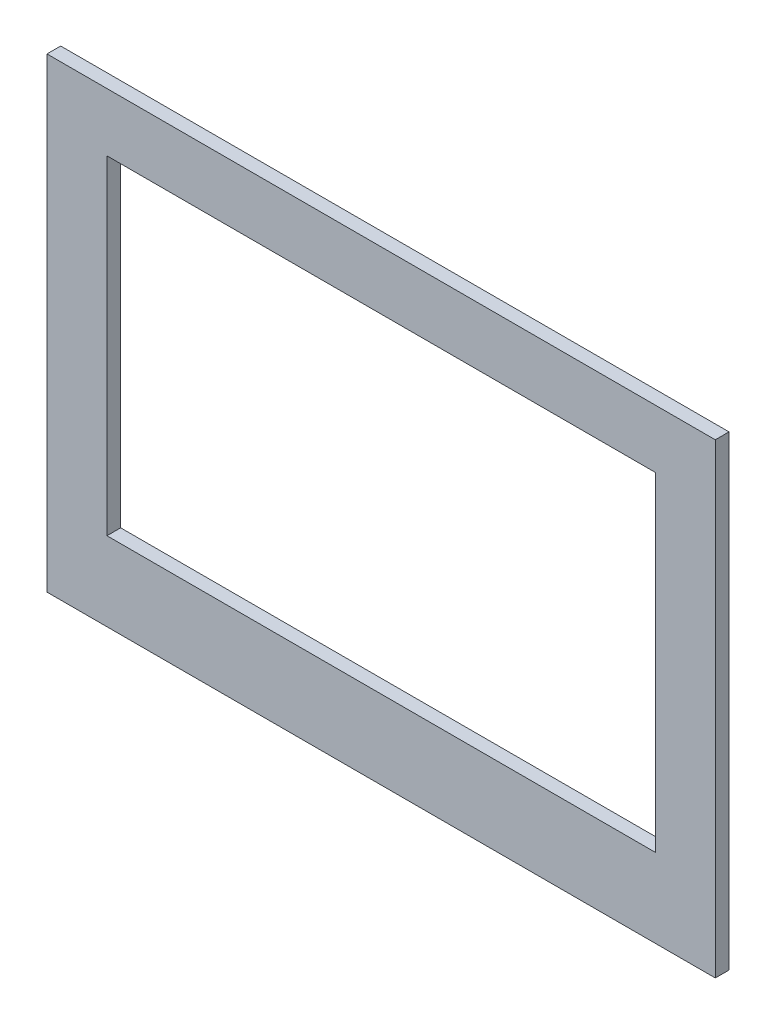
ISO-10303-21;
HEADER;
FILE_DESCRIPTION(('STEP AP214'),'2;1');
FILE_NAME('part.step','',(''),(''),'','','');
FILE_SCHEMA(('AUTOMOTIVE_DESIGN { 1 0 10303 214 1 1 1 1 }'));
ENDSEC;
DATA;
#1=APPLICATION_CONTEXT('core data for automotive mechanical design processes');
#2=APPLICATION_PROTOCOL_DEFINITION('international standard','automotive_design',2000,#1);
#3=PRODUCT_CONTEXT('',#1,'mechanical');
#4=PRODUCT('Part','Part','',(#3));
#5=PRODUCT_RELATED_PRODUCT_CATEGORY('part','',(#4));
#6=PRODUCT_DEFINITION_FORMATION('','',#4);
#7=PRODUCT_DEFINITION_CONTEXT('part definition',#1,'design');
#8=PRODUCT_DEFINITION('design','',#6,#7);
#9=PRODUCT_DEFINITION_SHAPE('','',#8);
#10=(LENGTH_UNIT() NAMED_UNIT(*) SI_UNIT(.MILLI.,.METRE.));
#11=(NAMED_UNIT(*) PLANE_ANGLE_UNIT() SI_UNIT($,.RADIAN.));
#12=(NAMED_UNIT(*) SI_UNIT($,.STERADIAN.) SOLID_ANGLE_UNIT());
#13=UNCERTAINTY_MEASURE_WITH_UNIT(LENGTH_MEASURE(1.E-05),#10,'distance_accuracy_value','');
#14=(GEOMETRIC_REPRESENTATION_CONTEXT(3) GLOBAL_UNCERTAINTY_ASSIGNED_CONTEXT((#13)) GLOBAL_UNIT_ASSIGNED_CONTEXT((#10,
#11,#12)) REPRESENTATION_CONTEXT('',''));
#15=CARTESIAN_POINT('',(0.,0.,0.));
#16=DIRECTION('',(0.,0.,1.));
#17=DIRECTION('',(1.,0.,0.));
#18=AXIS2_PLACEMENT_3D('',#15,#16,#17);
#19=CARTESIAN_POINT('',(0.,68.,-2.));
#20=DIRECTION('',(0.,1.,0.));
#21=DIRECTION('',(0.,0.,1.));
#22=AXIS2_PLACEMENT_3D('',#19,#20,#21);
#23=PLANE('',#22);
#24=DIRECTION('',(0.,0.,1.));
#25=VECTOR('',#24,1.);
#26=CARTESIAN_POINT('',(-97.5,68.,-2.));
#27=LINE('',#26,#25);
#28=CARTESIAN_POINT('',(-97.5,68.,-2.));
#29=VERTEX_POINT('',#28);
#30=CARTESIAN_POINT('',(-97.5,68.,2.));
#31=VERTEX_POINT('',#30);
#32=EDGE_CURVE('E110',#29,#31,#27,.T.);
#33=ORIENTED_EDGE('',*,*,#32,.T.);
#34=DIRECTION('',(-1.,0.,0.));
#35=VECTOR('',#34,1.);
#36=CARTESIAN_POINT('',(0.,68.,2.));
#37=LINE('',#36,#35);
#38=CARTESIAN_POINT('',(97.4999999999999,68.,2.));
#39=VERTEX_POINT('',#38);
#40=EDGE_CURVE('E113',#39,#31,#37,.T.);
#41=ORIENTED_EDGE('',*,*,#40,.F.);
#42=DIRECTION('',(0.,0.,1.));
#43=VECTOR('',#42,1.);
#44=CARTESIAN_POINT('',(97.4999999999999,68.,-2.));
#45=LINE('',#44,#43);
#46=CARTESIAN_POINT('',(97.4999999999999,68.,-2.));
#47=VERTEX_POINT('',#46);
#48=EDGE_CURVE('E11',#47,#39,#45,.T.);
#49=ORIENTED_EDGE('',*,*,#48,.F.);
#50=DIRECTION('',(-1.,0.,0.));
#51=VECTOR('',#50,1.);
#52=CARTESIAN_POINT('',(0.,68.,-2.));
#53=LINE('',#52,#51);
#54=EDGE_CURVE('E116',#47,#29,#53,.T.);
#55=ORIENTED_EDGE('',*,*,#54,.T.);
#56=EDGE_LOOP('',(#33,#41,#49,#55));
#57=FACE_BOUND('',#56,.T.);
#58=ADVANCED_FACE('F46',(#57),#23,.T.);
#59=CARTESIAN_POINT('',(97.4999999999999,0.,-2.));
#60=DIRECTION('',(-1.,0.,0.));
#61=DIRECTION('',(0.,0.,1.));
#62=AXIS2_PLACEMENT_3D('',#59,#60,#61);
#63=PLANE('',#62);
#64=ORIENTED_EDGE('',*,*,#48,.T.);
#65=DIRECTION('',(0.,-1.,0.));
#66=VECTOR('',#65,1.);
#67=CARTESIAN_POINT('',(97.4999999999999,0.,2.));
#68=LINE('',#67,#66);
#69=CARTESIAN_POINT('',(97.4999999999999,-68.,2.));
#70=VERTEX_POINT('',#69);
#71=EDGE_CURVE('E136',#39,#70,#68,.T.);
#72=ORIENTED_EDGE('',*,*,#71,.T.);
#73=DIRECTION('',(0.,0.,1.));
#74=VECTOR('',#73,1.);
#75=CARTESIAN_POINT('',(97.4999999999999,-68.,-2.));
#76=LINE('',#75,#74);
#77=CARTESIAN_POINT('',(97.4999999999999,-68.,-2.));
#78=VERTEX_POINT('',#77);
#79=EDGE_CURVE('E56',#78,#70,#76,.T.);
#80=ORIENTED_EDGE('',*,*,#79,.F.);
#81=DIRECTION('',(0.,-1.,0.));
#82=VECTOR('',#81,1.);
#83=CARTESIAN_POINT('',(97.4999999999999,0.,-2.));
#84=LINE('',#83,#82);
#85=EDGE_CURVE('E187',#47,#78,#84,.T.);
#86=ORIENTED_EDGE('',*,*,#85,.F.);
#87=EDGE_LOOP('',(#64,#72,#80,#86));
#88=FACE_BOUND('',#87,.T.);
#89=ADVANCED_FACE('F229',(#88),#63,.F.);
#90=CARTESIAN_POINT('',(0.,-68.,-2.));
#91=DIRECTION('',(0.,1.,0.));
#92=DIRECTION('',(0.,0.,1.));
#93=AXIS2_PLACEMENT_3D('',#90,#91,#92);
#94=PLANE('',#93);
#95=ORIENTED_EDGE('',*,*,#79,.T.);
#96=DIRECTION('',(-1.,0.,0.));
#97=VECTOR('',#96,1.);
#98=CARTESIAN_POINT('',(0.,-68.,2.));
#99=LINE('',#98,#97);
#100=CARTESIAN_POINT('',(-97.5,-68.,2.));
#101=VERTEX_POINT('',#100);
#102=EDGE_CURVE('E131',#70,#101,#99,.T.);
#103=ORIENTED_EDGE('',*,*,#102,.T.);
#104=DIRECTION('',(0.,0.,1.));
#105=VECTOR('',#104,1.);
#106=CARTESIAN_POINT('',(-97.5,-68.,-2.));
#107=LINE('',#106,#105);
#108=CARTESIAN_POINT('',(-97.5,-68.,-2.));
#109=VERTEX_POINT('',#108);
#110=EDGE_CURVE('E121',#109,#101,#107,.T.);
#111=ORIENTED_EDGE('',*,*,#110,.F.);
#112=DIRECTION('',(-1.,0.,0.));
#113=VECTOR('',#112,1.);
#114=CARTESIAN_POINT('',(0.,-68.,-2.));
#115=LINE('',#114,#113);
#116=EDGE_CURVE('E70',#78,#109,#115,.T.);
#117=ORIENTED_EDGE('',*,*,#116,.F.);
#118=EDGE_LOOP('',(#95,#103,#111,#117));
#119=FACE_BOUND('',#118,.T.);
#120=ADVANCED_FACE('F234',(#119),#94,.F.);
#121=CARTESIAN_POINT('',(0.,-45.,-2.));
#122=DIRECTION('',(0.,1.,0.));
#123=DIRECTION('',(-1.,0.,0.));
#124=AXIS2_PLACEMENT_3D('',#121,#122,#123);
#125=PLANE('',#124);
#126=DIRECTION('',(0.,0.,1.));
#127=VECTOR('',#126,1.);
#128=CARTESIAN_POINT('',(-80.,-45.,-2.));
#129=LINE('',#128,#127);
#130=CARTESIAN_POINT('',(-80.,-45.,-2.));
#131=VERTEX_POINT('',#130);
#132=CARTESIAN_POINT('',(-80.,-45.,2.));
#133=VERTEX_POINT('',#132);
#134=EDGE_CURVE('E50',#131,#133,#129,.T.);
#135=ORIENTED_EDGE('',*,*,#134,.T.);
#136=DIRECTION('',(-1.,0.,0.));
#137=VECTOR('',#136,1.);
#138=CARTESIAN_POINT('',(0.,-45.,2.));
#139=LINE('',#138,#137);
#140=CARTESIAN_POINT('',(80.,-45.,2.));
#141=VERTEX_POINT('',#140);
#142=EDGE_CURVE('E150',#141,#133,#139,.T.);
#143=ORIENTED_EDGE('',*,*,#142,.F.);
#144=DIRECTION('',(0.,0.,1.));
#145=VECTOR('',#144,1.);
#146=CARTESIAN_POINT('',(80.,-45.,-2.));
#147=LINE('',#146,#145);
#148=CARTESIAN_POINT('',(80.,-45.,-2.));
#149=VERTEX_POINT('',#148);
#150=EDGE_CURVE('E122',#149,#141,#147,.T.);
#151=ORIENTED_EDGE('',*,*,#150,.F.);
#152=DIRECTION('',(-1.,0.,0.));
#153=VECTOR('',#152,1.);
#154=CARTESIAN_POINT('',(0.,-45.,-2.));
#155=LINE('',#154,#153);
#156=EDGE_CURVE('E166',#149,#131,#155,.T.);
#157=ORIENTED_EDGE('',*,*,#156,.T.);
#158=EDGE_LOOP('',(#135,#143,#151,#157));
#159=FACE_BOUND('',#158,.T.);
#160=ADVANCED_FACE('F48',(#159),#125,.T.);
#161=CARTESIAN_POINT('',(80.,0.,-2.));
#162=DIRECTION('',(1.,0.,0.));
#163=DIRECTION('',(0.,0.,-1.));
#164=AXIS2_PLACEMENT_3D('',#161,#162,#163);
#165=PLANE('',#164);
#166=ORIENTED_EDGE('',*,*,#150,.T.);
#167=DIRECTION('',(0.,1.,0.));
#168=VECTOR('',#167,1.);
#169=CARTESIAN_POINT('',(80.,0.,2.));
#170=LINE('',#169,#168);
#171=CARTESIAN_POINT('',(80.,51.,2.));
#172=VERTEX_POINT('',#171);
#173=EDGE_CURVE('E162',#141,#172,#170,.T.);
#174=ORIENTED_EDGE('',*,*,#173,.T.);
#175=DIRECTION('',(0.,0.,1.));
#176=VECTOR('',#175,1.);
#177=CARTESIAN_POINT('',(80.,51.,-2.));
#178=LINE('',#177,#176);
#179=CARTESIAN_POINT('',(80.,51.,-2.));
#180=VERTEX_POINT('',#179);
#181=EDGE_CURVE('E196',#180,#172,#178,.T.);
#182=ORIENTED_EDGE('',*,*,#181,.F.);
#183=DIRECTION('',(0.,1.,0.));
#184=VECTOR('',#183,1.);
#185=CARTESIAN_POINT('',(80.,0.,-2.));
#186=LINE('',#185,#184);
#187=EDGE_CURVE('E177',#149,#180,#186,.T.);
#188=ORIENTED_EDGE('',*,*,#187,.F.);
#189=EDGE_LOOP('',(#166,#174,#182,#188));
#190=FACE_BOUND('',#189,.T.);
#191=ADVANCED_FACE('F213',(#190),#165,.F.);
#192=CARTESIAN_POINT('',(0.,51.,-2.));
#193=DIRECTION('',(0.,1.,0.));
#194=DIRECTION('',(-1.,0.,0.));
#195=AXIS2_PLACEMENT_3D('',#192,#193,#194);
#196=PLANE('',#195);
#197=ORIENTED_EDGE('',*,*,#181,.T.);
#198=DIRECTION('',(-1.,0.,0.));
#199=VECTOR('',#198,1.);
#200=CARTESIAN_POINT('',(0.,51.,2.));
#201=LINE('',#200,#199);
#202=CARTESIAN_POINT('',(-80.,51.,2.));
#203=VERTEX_POINT('',#202);
#204=EDGE_CURVE('E158',#172,#203,#201,.T.);
#205=ORIENTED_EDGE('',*,*,#204,.T.);
#206=DIRECTION('',(0.,0.,1.));
#207=VECTOR('',#206,1.);
#208=CARTESIAN_POINT('',(-80.,51.,-2.));
#209=LINE('',#208,#207);
#210=CARTESIAN_POINT('',(-80.,51.,-2.));
#211=VERTEX_POINT('',#210);
#212=EDGE_CURVE('E198',#211,#203,#209,.T.);
#213=ORIENTED_EDGE('',*,*,#212,.F.);
#214=DIRECTION('',(-1.,0.,0.));
#215=VECTOR('',#214,1.);
#216=CARTESIAN_POINT('',(0.,51.,-2.));
#217=LINE('',#216,#215);
#218=EDGE_CURVE('E174',#180,#211,#217,.T.);
#219=ORIENTED_EDGE('',*,*,#218,.F.);
#220=EDGE_LOOP('',(#197,#205,#213,#219));
#221=FACE_BOUND('',#220,.T.);
#222=ADVANCED_FACE('F220',(#221),#196,.F.);
#223=CARTESIAN_POINT('',(-80.,0.,-2.));
#224=DIRECTION('',(1.,0.,0.));
#225=DIRECTION('',(0.,0.,-1.));
#226=AXIS2_PLACEMENT_3D('',#223,#224,#225);
#227=PLANE('',#226);
#228=ORIENTED_EDGE('',*,*,#212,.T.);
#229=DIRECTION('',(0.,1.,0.));
#230=VECTOR('',#229,1.);
#231=CARTESIAN_POINT('',(-80.,0.,2.));
#232=LINE('',#231,#230);
#233=EDGE_CURVE('E154',#133,#203,#232,.T.);
#234=ORIENTED_EDGE('',*,*,#233,.F.);
#235=ORIENTED_EDGE('',*,*,#134,.F.);
#236=DIRECTION('',(0.,1.,0.));
#237=VECTOR('',#236,1.);
#238=CARTESIAN_POINT('',(-80.,0.,-2.));
#239=LINE('',#238,#237);
#240=EDGE_CURVE('E170',#131,#211,#239,.T.);
#241=ORIENTED_EDGE('',*,*,#240,.T.);
#242=EDGE_LOOP('',(#228,#234,#235,#241));
#243=FACE_BOUND('',#242,.T.);
#244=ADVANCED_FACE('F209',(#243),#227,.T.);
#245=CARTESIAN_POINT('',(-97.5,0.,-2.));
#246=DIRECTION('',(-1.,0.,0.));
#247=DIRECTION('',(0.,0.,1.));
#248=AXIS2_PLACEMENT_3D('',#245,#246,#247);
#249=PLANE('',#248);
#250=ORIENTED_EDGE('',*,*,#110,.T.);
#251=DIRECTION('',(0.,-1.,0.));
#252=VECTOR('',#251,1.);
#253=CARTESIAN_POINT('',(-97.5,0.,2.));
#254=LINE('',#253,#252);
#255=EDGE_CURVE('E125',#31,#101,#254,.T.);
#256=ORIENTED_EDGE('',*,*,#255,.F.);
#257=ORIENTED_EDGE('',*,*,#32,.F.);
#258=DIRECTION('',(0.,-1.,0.));
#259=VECTOR('',#258,1.);
#260=CARTESIAN_POINT('',(-97.5,0.,-2.));
#261=LINE('',#260,#259);
#262=EDGE_CURVE('E182',#29,#109,#261,.T.);
#263=ORIENTED_EDGE('',*,*,#262,.T.);
#264=EDGE_LOOP('',(#250,#256,#257,#263));
#265=FACE_BOUND('',#264,.T.);
#266=ADVANCED_FACE('F126',(#265),#249,.T.);
#267=CARTESIAN_POINT('',(0.,0.,-2.));
#268=DIRECTION('',(0.,0.,1.));
#269=DIRECTION('',(1.,0.,0.));
#270=AXIS2_PLACEMENT_3D('',#267,#268,#269);
#271=PLANE('',#270);
#272=ORIENTED_EDGE('',*,*,#156,.F.);
#273=ORIENTED_EDGE('',*,*,#187,.T.);
#274=ORIENTED_EDGE('',*,*,#218,.T.);
#275=ORIENTED_EDGE('',*,*,#240,.F.);
#276=EDGE_LOOP('',(#272,#273,#274,#275));
#277=FACE_BOUND('',#276,.T.);
#278=ORIENTED_EDGE('',*,*,#54,.F.);
#279=ORIENTED_EDGE('',*,*,#85,.T.);
#280=ORIENTED_EDGE('',*,*,#116,.T.);
#281=ORIENTED_EDGE('',*,*,#262,.F.);
#282=EDGE_LOOP('',(#278,#279,#280,#281));
#283=FACE_BOUND('',#282,.T.);
#284=ADVANCED_FACE('F217',(#277,#283),#271,.F.);
#285=CARTESIAN_POINT('',(0.,0.,2.));
#286=DIRECTION('',(0.,0.,1.));
#287=DIRECTION('',(1.,0.,0.));
#288=AXIS2_PLACEMENT_3D('',#285,#286,#287);
#289=PLANE('',#288);
#290=ORIENTED_EDGE('',*,*,#40,.T.);
#291=ORIENTED_EDGE('',*,*,#255,.T.);
#292=ORIENTED_EDGE('',*,*,#102,.F.);
#293=ORIENTED_EDGE('',*,*,#71,.F.);
#294=EDGE_LOOP('',(#290,#291,#292,#293));
#295=FACE_BOUND('',#294,.T.);
#296=ORIENTED_EDGE('',*,*,#142,.T.);
#297=ORIENTED_EDGE('',*,*,#233,.T.);
#298=ORIENTED_EDGE('',*,*,#204,.F.);
#299=ORIENTED_EDGE('',*,*,#173,.F.);
#300=EDGE_LOOP('',(#296,#297,#298,#299));
#301=FACE_BOUND('',#300,.T.);
#302=ADVANCED_FACE('F133',(#295,#301),#289,.T.);
#303=CLOSED_SHELL('',(#58,#89,#120,#160,#191,#222,#244,#266,#284,#302));
#304=CARTESIAN_POINT('',(-90.5,0.,1.375));
#305=DIRECTION('',(0.,0.,-1.));
#306=DIRECTION('',(-1.,0.,0.));
#307=AXIS2_PLACEMENT_3D('',#304,#305,#306);
#308=CYLINDRICAL_SURFACE('',#307,3.25000000000001);
#309=CARTESIAN_POINT('',(-90.5,0.,1.375));
#310=DIRECTION('',(0.,0.,1.));
#311=DIRECTION('',(1.,0.,0.));
#312=AXIS2_PLACEMENT_3D('',#309,#310,#311);
#313=CIRCLE('',#312,3.25000000000001);
#314=CARTESIAN_POINT('',(-87.25,0.,1.375));
#315=VERTEX_POINT('',#314);
#316=EDGE_CURVE('E395',#315,#315,#313,.T.);
#317=ORIENTED_EDGE('',*,*,#316,.T.);
#318=EDGE_LOOP('',(#317));
#319=FACE_BOUND('',#318,.T.);
#320=CARTESIAN_POINT('',(-90.5,0.,-1.375));
#321=DIRECTION('',(0.,0.,1.));
#322=DIRECTION('',(1.,0.,0.));
#323=AXIS2_PLACEMENT_3D('',#320,#321,#322);
#324=CIRCLE('',#323,3.25000000000001);
#325=CARTESIAN_POINT('',(-87.25,0.,-1.375));
#326=VERTEX_POINT('',#325);
#327=EDGE_CURVE('E399',#326,#326,#324,.T.);
#328=ORIENTED_EDGE('',*,*,#327,.F.);
#329=EDGE_LOOP('',(#328));
#330=FACE_BOUND('',#329,.T.);
#331=ADVANCED_FACE('F310',(#319,#330),#308,.F.);
#332=CARTESIAN_POINT('',(-90.5,0.,1.375));
#333=DIRECTION('',(0.,0.,1.));
#334=DIRECTION('',(1.,0.,0.));
#335=AXIS2_PLACEMENT_3D('',#332,#333,#334);
#336=PLANE('',#335);
#337=ORIENTED_EDGE('',*,*,#316,.F.);
#338=EDGE_LOOP('',(#337));
#339=FACE_BOUND('',#338,.T.);
#340=ADVANCED_FACE('F305',(#339),#336,.F.);
#341=CARTESIAN_POINT('',(-90.5,0.,-1.375));
#342=DIRECTION('',(0.,0.,1.));
#343=DIRECTION('',(1.,0.,0.));
#344=AXIS2_PLACEMENT_3D('',#341,#342,#343);
#345=PLANE('',#344);
#346=ORIENTED_EDGE('',*,*,#327,.T.);
#347=EDGE_LOOP('',(#346));
#348=FACE_BOUND('',#347,.T.);
#349=ADVANCED_FACE('F302',(#348),#345,.T.);
#350=CLOSED_SHELL('',(#331,#340,#349));
#351=CARTESIAN_POINT('',(90.5,61.,1.375));
#352=DIRECTION('',(0.,0.,-1.));
#353=DIRECTION('',(-1.,0.,0.));
#354=AXIS2_PLACEMENT_3D('',#351,#352,#353);
#355=CYLINDRICAL_SURFACE('',#354,3.25000000000001);
#356=CARTESIAN_POINT('',(90.5,61.,1.375));
#357=DIRECTION('',(0.,0.,1.));
#358=DIRECTION('',(1.,0.,0.));
#359=AXIS2_PLACEMENT_3D('',#356,#357,#358);
#360=CIRCLE('',#359,3.25000000000001);
#361=CARTESIAN_POINT('',(93.75,61.,1.375));
#362=VERTEX_POINT('',#361);
#363=EDGE_CURVE('E404',#362,#362,#360,.T.);
#364=ORIENTED_EDGE('',*,*,#363,.T.);
#365=EDGE_LOOP('',(#364));
#366=FACE_BOUND('',#365,.T.);
#367=CARTESIAN_POINT('',(90.5,61.,-1.375));
#368=DIRECTION('',(0.,0.,1.));
#369=DIRECTION('',(1.,0.,0.));
#370=AXIS2_PLACEMENT_3D('',#367,#368,#369);
#371=CIRCLE('',#370,3.25000000000001);
#372=CARTESIAN_POINT('',(93.75,61.,-1.375));
#373=VERTEX_POINT('',#372);
#374=EDGE_CURVE('E400',#373,#373,#371,.T.);
#375=ORIENTED_EDGE('',*,*,#374,.F.);
#376=EDGE_LOOP('',(#375));
#377=FACE_BOUND('',#376,.T.);
#378=ADVANCED_FACE('F297',(#366,#377),#355,.F.);
#379=CARTESIAN_POINT('',(90.5,61.,1.375));
#380=DIRECTION('',(0.,0.,1.));
#381=DIRECTION('',(1.,0.,0.));
#382=AXIS2_PLACEMENT_3D('',#379,#380,#381);
#383=PLANE('',#382);
#384=ORIENTED_EDGE('',*,*,#363,.F.);
#385=EDGE_LOOP('',(#384));
#386=FACE_BOUND('',#385,.T.);
#387=ADVANCED_FACE('F291',(#386),#383,.F.);
#388=CARTESIAN_POINT('',(90.5,61.,-1.375));
#389=DIRECTION('',(0.,0.,1.));
#390=DIRECTION('',(1.,0.,0.));
#391=AXIS2_PLACEMENT_3D('',#388,#389,#390);
#392=PLANE('',#391);
#393=ORIENTED_EDGE('',*,*,#374,.T.);
#394=EDGE_LOOP('',(#393));
#395=FACE_BOUND('',#394,.T.);
#396=ADVANCED_FACE('F288',(#395),#392,.T.);
#397=CLOSED_SHELL('',(#378,#387,#396));
#398=CARTESIAN_POINT('',(-30.1666666666667,-61.,1.375));
#399=DIRECTION('',(0.,0.,-1.));
#400=DIRECTION('',(-1.,0.,0.));
#401=AXIS2_PLACEMENT_3D('',#398,#399,#400);
#402=CYLINDRICAL_SURFACE('',#401,3.25);
#403=CARTESIAN_POINT('',(-30.1666666666667,-61.,1.375));
#404=DIRECTION('',(0.,0.,1.));
#405=DIRECTION('',(1.,0.,0.));
#406=AXIS2_PLACEMENT_3D('',#403,#404,#405);
#407=CIRCLE('',#406,3.25);
#408=CARTESIAN_POINT('',(-26.9166666666667,-61.,1.375));
#409=VERTEX_POINT('',#408);
#410=EDGE_CURVE('E412',#409,#409,#407,.T.);
#411=ORIENTED_EDGE('',*,*,#410,.T.);
#412=EDGE_LOOP('',(#411));
#413=FACE_BOUND('',#412,.T.);
#414=CARTESIAN_POINT('',(-30.1666666666667,-61.,-1.375));
#415=DIRECTION('',(0.,0.,1.));
#416=DIRECTION('',(1.,0.,0.));
#417=AXIS2_PLACEMENT_3D('',#414,#415,#416);
#418=CIRCLE('',#417,3.25);
#419=CARTESIAN_POINT('',(-26.9166666666667,-61.,-1.375));
#420=VERTEX_POINT('',#419);
#421=EDGE_CURVE('E408',#420,#420,#418,.T.);
#422=ORIENTED_EDGE('',*,*,#421,.F.);
#423=EDGE_LOOP('',(#422));
#424=FACE_BOUND('',#423,.T.);
#425=ADVANCED_FACE('F283',(#413,#424),#402,.F.);
#426=CARTESIAN_POINT('',(-30.1666666666667,-61.,1.375));
#427=DIRECTION('',(0.,0.,1.));
#428=DIRECTION('',(1.,0.,0.));
#429=AXIS2_PLACEMENT_3D('',#426,#427,#428);
#430=PLANE('',#429);
#431=ORIENTED_EDGE('',*,*,#410,.F.);
#432=EDGE_LOOP('',(#431));
#433=FACE_BOUND('',#432,.T.);
#434=ADVANCED_FACE('F277',(#433),#430,.F.);
#435=CARTESIAN_POINT('',(-30.1666666666667,-61.,-1.375));
#436=DIRECTION('',(0.,0.,1.));
#437=DIRECTION('',(1.,0.,0.));
#438=AXIS2_PLACEMENT_3D('',#435,#436,#437);
#439=PLANE('',#438);
#440=ORIENTED_EDGE('',*,*,#421,.T.);
#441=EDGE_LOOP('',(#440));
#442=FACE_BOUND('',#441,.T.);
#443=ADVANCED_FACE('F274',(#442),#439,.T.);
#444=CLOSED_SHELL('',(#425,#434,#443));
#445=CARTESIAN_POINT('',(30.1666666666666,-61.,1.375));
#446=DIRECTION('',(0.,0.,-1.));
#447=DIRECTION('',(-1.,0.,0.));
#448=AXIS2_PLACEMENT_3D('',#445,#446,#447);
#449=CYLINDRICAL_SURFACE('',#448,3.25);
#450=CARTESIAN_POINT('',(30.1666666666666,-61.,1.375));
#451=DIRECTION('',(0.,0.,1.));
#452=DIRECTION('',(1.,0.,0.));
#453=AXIS2_PLACEMENT_3D('',#450,#451,#452);
#454=CIRCLE('',#453,3.25);
#455=CARTESIAN_POINT('',(33.4166666666666,-61.,1.375));
#456=VERTEX_POINT('',#455);
#457=EDGE_CURVE('E390',#456,#456,#454,.T.);
#458=ORIENTED_EDGE('',*,*,#457,.T.);
#459=EDGE_LOOP('',(#458));
#460=FACE_BOUND('',#459,.T.);
#461=CARTESIAN_POINT('',(30.1666666666666,-61.,-1.375));
#462=DIRECTION('',(0.,0.,1.));
#463=DIRECTION('',(1.,0.,0.));
#464=AXIS2_PLACEMENT_3D('',#461,#462,#463);
#465=CIRCLE('',#464,3.25);
#466=CARTESIAN_POINT('',(33.4166666666666,-61.,-1.375));
#467=VERTEX_POINT('',#466);
#468=EDGE_CURVE('E416',#467,#467,#465,.T.);
#469=ORIENTED_EDGE('',*,*,#468,.F.);
#470=EDGE_LOOP('',(#469));
#471=FACE_BOUND('',#470,.T.);
#472=ADVANCED_FACE('F269',(#460,#471),#449,.F.);
#473=CARTESIAN_POINT('',(30.1666666666666,-61.,1.375));
#474=DIRECTION('',(0.,0.,1.));
#475=DIRECTION('',(1.,0.,0.));
#476=AXIS2_PLACEMENT_3D('',#473,#474,#475);
#477=PLANE('',#476);
#478=ORIENTED_EDGE('',*,*,#457,.F.);
#479=EDGE_LOOP('',(#478));
#480=FACE_BOUND('',#479,.T.);
#481=ADVANCED_FACE('F263',(#480),#477,.F.);
#482=CARTESIAN_POINT('',(30.1666666666666,-61.,-1.375));
#483=DIRECTION('',(0.,0.,1.));
#484=DIRECTION('',(1.,0.,0.));
#485=AXIS2_PLACEMENT_3D('',#482,#483,#484);
#486=PLANE('',#485);
#487=ORIENTED_EDGE('',*,*,#468,.T.);
#488=EDGE_LOOP('',(#487));
#489=FACE_BOUND('',#488,.T.);
#490=ADVANCED_FACE('F260',(#489),#486,.T.);
#491=CLOSED_SHELL('',(#472,#481,#490));
#492=CARTESIAN_POINT('',(30.1666666666666,61.,1.375));
#493=DIRECTION('',(0.,0.,-1.));
#494=DIRECTION('',(-1.,0.,0.));
#495=AXIS2_PLACEMENT_3D('',#492,#493,#494);
#496=CYLINDRICAL_SURFACE('',#495,3.25);
#497=CARTESIAN_POINT('',(30.1666666666666,61.,1.375));
#498=DIRECTION('',(0.,0.,1.));
#499=DIRECTION('',(1.,0.,0.));
#500=AXIS2_PLACEMENT_3D('',#497,#498,#499);
#501=CIRCLE('',#500,3.25);
#502=CARTESIAN_POINT('',(33.4166666666666,61.,1.375));
#503=VERTEX_POINT('',#502);
#504=EDGE_CURVE('E369',#503,#503,#501,.T.);
#505=ORIENTED_EDGE('',*,*,#504,.T.);
#506=EDGE_LOOP('',(#505));
#507=FACE_BOUND('',#506,.T.);
#508=CARTESIAN_POINT('',(30.1666666666666,61.,-1.375));
#509=DIRECTION('',(0.,0.,1.));
#510=DIRECTION('',(1.,0.,0.));
#511=AXIS2_PLACEMENT_3D('',#508,#509,#510);
#512=CIRCLE('',#511,3.25);
#513=CARTESIAN_POINT('',(33.4166666666666,61.,-1.375));
#514=VERTEX_POINT('',#513);
#515=EDGE_CURVE('E372',#514,#514,#512,.T.);
#516=ORIENTED_EDGE('',*,*,#515,.F.);
#517=EDGE_LOOP('',(#516));
#518=FACE_BOUND('',#517,.T.);
#519=ADVANCED_FACE('F352',(#507,#518),#496,.F.);
#520=CARTESIAN_POINT('',(30.1666666666666,61.,1.375));
#521=DIRECTION('',(0.,0.,1.));
#522=DIRECTION('',(1.,0.,0.));
#523=AXIS2_PLACEMENT_3D('',#520,#521,#522);
#524=PLANE('',#523);
#525=ORIENTED_EDGE('',*,*,#504,.F.);
#526=EDGE_LOOP('',(#525));
#527=FACE_BOUND('',#526,.T.);
#528=ADVANCED_FACE('F346',(#527),#524,.F.);
#529=CARTESIAN_POINT('',(30.1666666666666,61.,-1.375));
#530=DIRECTION('',(0.,0.,1.));
#531=DIRECTION('',(1.,0.,0.));
#532=AXIS2_PLACEMENT_3D('',#529,#530,#531);
#533=PLANE('',#532);
#534=ORIENTED_EDGE('',*,*,#515,.T.);
#535=EDGE_LOOP('',(#534));
#536=FACE_BOUND('',#535,.T.);
#537=ADVANCED_FACE('F343',(#536),#533,.T.);
#538=CLOSED_SHELL('',(#519,#528,#537));
#539=CARTESIAN_POINT('',(-30.1666666666667,61.,1.375));
#540=DIRECTION('',(0.,0.,-1.));
#541=DIRECTION('',(-1.,0.,0.));
#542=AXIS2_PLACEMENT_3D('',#539,#540,#541);
#543=CYLINDRICAL_SURFACE('',#542,3.25);
#544=CARTESIAN_POINT('',(-30.1666666666667,61.,1.375));
#545=DIRECTION('',(0.,0.,1.));
#546=DIRECTION('',(1.,0.,0.));
#547=AXIS2_PLACEMENT_3D('',#544,#545,#546);
#548=CIRCLE('',#547,3.25);
#549=CARTESIAN_POINT('',(-26.9166666666667,61.,1.375));
#550=VERTEX_POINT('',#549);
#551=EDGE_CURVE('E374',#550,#550,#548,.T.);
#552=ORIENTED_EDGE('',*,*,#551,.T.);
#553=EDGE_LOOP('',(#552));
#554=FACE_BOUND('',#553,.T.);
#555=CARTESIAN_POINT('',(-30.1666666666667,61.,-1.375));
#556=DIRECTION('',(0.,0.,1.));
#557=DIRECTION('',(1.,0.,0.));
#558=AXIS2_PLACEMENT_3D('',#555,#556,#557);
#559=CIRCLE('',#558,3.25);
#560=CARTESIAN_POINT('',(-26.9166666666667,61.,-1.375));
#561=VERTEX_POINT('',#560);
#562=EDGE_CURVE('E379',#561,#561,#559,.T.);
#563=ORIENTED_EDGE('',*,*,#562,.F.);
#564=EDGE_LOOP('',(#563));
#565=FACE_BOUND('',#564,.T.);
#566=ADVANCED_FACE('F324',(#554,#565),#543,.F.);
#567=CARTESIAN_POINT('',(-30.1666666666667,61.,1.375));
#568=DIRECTION('',(0.,0.,1.));
#569=DIRECTION('',(1.,0.,0.));
#570=AXIS2_PLACEMENT_3D('',#567,#568,#569);
#571=PLANE('',#570);
#572=ORIENTED_EDGE('',*,*,#551,.F.);
#573=EDGE_LOOP('',(#572));
#574=FACE_BOUND('',#573,.T.);
#575=ADVANCED_FACE('F318',(#574),#571,.F.);
#576=CARTESIAN_POINT('',(-30.1666666666667,61.,-1.375));
#577=DIRECTION('',(0.,0.,1.));
#578=DIRECTION('',(1.,0.,0.));
#579=AXIS2_PLACEMENT_3D('',#576,#577,#578);
#580=PLANE('',#579);
#581=ORIENTED_EDGE('',*,*,#562,.T.);
#582=EDGE_LOOP('',(#581));
#583=FACE_BOUND('',#582,.T.);
#584=ADVANCED_FACE('F315',(#583),#580,.T.);
#585=CLOSED_SHELL('',(#566,#575,#584));
#586=CARTESIAN_POINT('',(90.5,0.,1.375));
#587=DIRECTION('',(0.,0.,-1.));
#588=DIRECTION('',(-1.,0.,0.));
#589=AXIS2_PLACEMENT_3D('',#586,#587,#588);
#590=CYLINDRICAL_SURFACE('',#589,3.25000000000001);
#591=CARTESIAN_POINT('',(90.5,0.,1.375));
#592=DIRECTION('',(0.,0.,1.));
#593=DIRECTION('',(1.,0.,0.));
#594=AXIS2_PLACEMENT_3D('',#591,#592,#593);
#595=CIRCLE('',#594,3.25000000000001);
#596=CARTESIAN_POINT('',(93.75,0.,1.375));
#597=VERTEX_POINT('',#596);
#598=EDGE_CURVE('E383',#597,#597,#595,.T.);
#599=ORIENTED_EDGE('',*,*,#598,.T.);
#600=EDGE_LOOP('',(#599));
#601=FACE_BOUND('',#600,.T.);
#602=CARTESIAN_POINT('',(90.5,0.,-1.375));
#603=DIRECTION('',(0.,0.,1.));
#604=DIRECTION('',(1.,0.,0.));
#605=AXIS2_PLACEMENT_3D('',#602,#603,#604);
#606=CIRCLE('',#605,3.25000000000001);
#607=CARTESIAN_POINT('',(93.75,0.,-1.375));
#608=VERTEX_POINT('',#607);
#609=EDGE_CURVE('E387',#608,#608,#606,.T.);
#610=ORIENTED_EDGE('',*,*,#609,.F.);
#611=EDGE_LOOP('',(#610));
#612=FACE_BOUND('',#611,.T.);
#613=ADVANCED_FACE('F338',(#601,#612),#590,.F.);
#614=CARTESIAN_POINT('',(90.5,0.,1.375));
#615=DIRECTION('',(0.,0.,1.));
#616=DIRECTION('',(1.,0.,0.));
#617=AXIS2_PLACEMENT_3D('',#614,#615,#616);
#618=PLANE('',#617);
#619=ORIENTED_EDGE('',*,*,#598,.F.);
#620=EDGE_LOOP('',(#619));
#621=FACE_BOUND('',#620,.T.);
#622=ADVANCED_FACE('F332',(#621),#618,.F.);
#623=CARTESIAN_POINT('',(90.5,0.,-1.375));
#624=DIRECTION('',(0.,0.,1.));
#625=DIRECTION('',(1.,0.,0.));
#626=AXIS2_PLACEMENT_3D('',#623,#624,#625);
#627=PLANE('',#626);
#628=ORIENTED_EDGE('',*,*,#609,.T.);
#629=EDGE_LOOP('',(#628));
#630=FACE_BOUND('',#629,.T.);
#631=ADVANCED_FACE('F329',(#630),#627,.T.);
#632=CLOSED_SHELL('',(#613,#622,#631));
#633=CARTESIAN_POINT('',(-90.5,61.,1.375));
#634=DIRECTION('',(0.,0.,-1.));
#635=DIRECTION('',(-1.,0.,0.));
#636=AXIS2_PLACEMENT_3D('',#633,#634,#635);
#637=CYLINDRICAL_SURFACE('',#636,3.25000000000001);
#638=CARTESIAN_POINT('',(-90.5,61.,1.375));
#639=DIRECTION('',(0.,0.,1.));
#640=DIRECTION('',(1.,0.,0.));
#641=AXIS2_PLACEMENT_3D('',#638,#639,#640);
#642=CIRCLE('',#641,3.25000000000001);
#643=CARTESIAN_POINT('',(-87.25,61.,1.375));
#644=VERTEX_POINT('',#643);
#645=EDGE_CURVE('E138',#644,#644,#642,.T.);
#646=ORIENTED_EDGE('',*,*,#645,.T.);
#647=EDGE_LOOP('',(#646));
#648=FACE_BOUND('',#647,.T.);
#649=CARTESIAN_POINT('',(-90.5,61.,-1.375));
#650=DIRECTION('',(0.,0.,1.));
#651=DIRECTION('',(1.,0.,0.));
#652=AXIS2_PLACEMENT_3D('',#649,#650,#651);
#653=CIRCLE('',#652,3.25000000000001);
#654=CARTESIAN_POINT('',(-87.25,61.,-1.375));
#655=VERTEX_POINT('',#654);
#656=EDGE_CURVE('E142',#655,#655,#653,.T.);
#657=ORIENTED_EDGE('',*,*,#656,.F.);
#658=EDGE_LOOP('',(#657));
#659=FACE_BOUND('',#658,.T.);
#660=ADVANCED_FACE('F246',(#648,#659),#637,.F.);
#661=CARTESIAN_POINT('',(-90.5,61.,1.375));
#662=DIRECTION('',(0.,0.,1.));
#663=DIRECTION('',(1.,0.,0.));
#664=AXIS2_PLACEMENT_3D('',#661,#662,#663);
#665=PLANE('',#664);
#666=ORIENTED_EDGE('',*,*,#645,.F.);
#667=EDGE_LOOP('',(#666));
#668=FACE_BOUND('',#667,.T.);
#669=ADVANCED_FACE('F249',(#668),#665,.F.);
#670=CARTESIAN_POINT('',(-90.5,61.,-1.375));
#671=DIRECTION('',(0.,0.,1.));
#672=DIRECTION('',(1.,0.,0.));
#673=AXIS2_PLACEMENT_3D('',#670,#671,#672);
#674=PLANE('',#673);
#675=ORIENTED_EDGE('',*,*,#656,.T.);
#676=EDGE_LOOP('',(#675));
#677=FACE_BOUND('',#676,.T.);
#678=ADVANCED_FACE('F255',(#677),#674,.T.);
#679=CLOSED_SHELL('',(#660,#669,#678));
#680=ORIENTED_CLOSED_SHELL('',*,#350,.T.);
#681=ORIENTED_CLOSED_SHELL('',*,#397,.T.);
#682=ORIENTED_CLOSED_SHELL('',*,#444,.T.);
#683=ORIENTED_CLOSED_SHELL('',*,#491,.T.);
#684=ORIENTED_CLOSED_SHELL('',*,#538,.T.);
#685=ORIENTED_CLOSED_SHELL('',*,#585,.T.);
#686=ORIENTED_CLOSED_SHELL('',*,#632,.T.);
#687=ORIENTED_CLOSED_SHELL('',*,#679,.T.);
#688=BREP_WITH_VOIDS('B2',#303,(#680,#681,#682,#683,#684,#685,#686,#687));
#689=ADVANCED_BREP_SHAPE_REPRESENTATION('',(#18,#688),#14);
#690=SHAPE_DEFINITION_REPRESENTATION(#9,#689);
ENDSEC;
END-ISO-10303-21;
